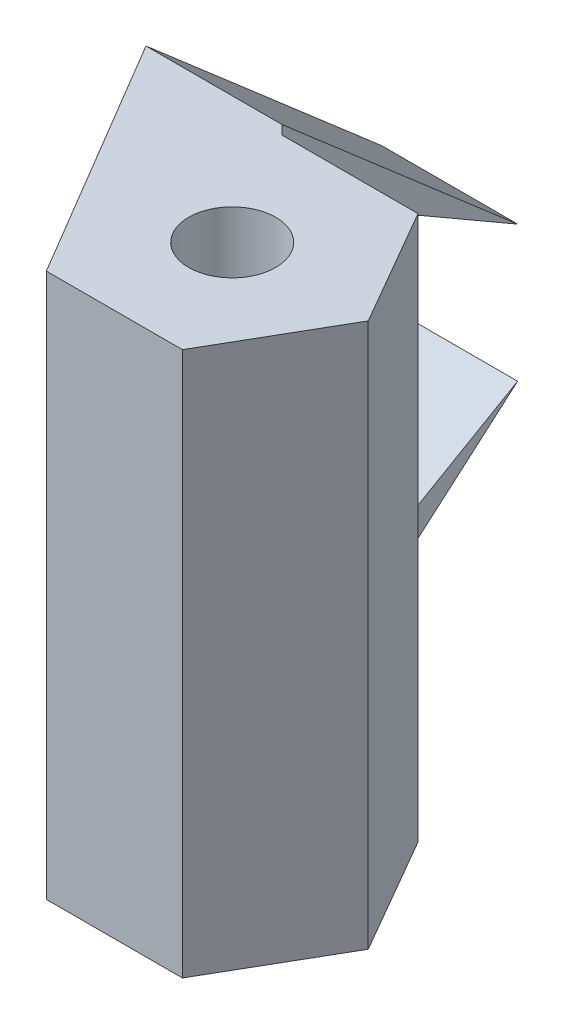
ISO-10303-21;
HEADER;
FILE_DESCRIPTION(('STEP AP214'),'2;1');
FILE_NAME('part.step','',(''),(''),'','','');
FILE_SCHEMA(('AUTOMOTIVE_DESIGN { 1 0 10303 214 1 1 1 1 }'));
ENDSEC;
DATA;
#1=APPLICATION_CONTEXT('core data for automotive mechanical design processes');
#2=APPLICATION_PROTOCOL_DEFINITION('international standard','automotive_design',2000,#1);
#3=PRODUCT_CONTEXT('',#1,'mechanical');
#4=PRODUCT('Part','Part','',(#3));
#5=PRODUCT_RELATED_PRODUCT_CATEGORY('part','',(#4));
#6=PRODUCT_DEFINITION_FORMATION('','',#4);
#7=PRODUCT_DEFINITION_CONTEXT('part definition',#1,'design');
#8=PRODUCT_DEFINITION('design','',#6,#7);
#9=PRODUCT_DEFINITION_SHAPE('','',#8);
#10=(LENGTH_UNIT() NAMED_UNIT(*) SI_UNIT(.MILLI.,.METRE.));
#11=(NAMED_UNIT(*) PLANE_ANGLE_UNIT() SI_UNIT($,.RADIAN.));
#12=(NAMED_UNIT(*) SI_UNIT($,.STERADIAN.) SOLID_ANGLE_UNIT());
#13=UNCERTAINTY_MEASURE_WITH_UNIT(LENGTH_MEASURE(1.E-05),#10,'distance_accuracy_value','');
#14=(GEOMETRIC_REPRESENTATION_CONTEXT(3) GLOBAL_UNCERTAINTY_ASSIGNED_CONTEXT((#13)) GLOBAL_UNIT_ASSIGNED_CONTEXT((#10,
#11,#12)) REPRESENTATION_CONTEXT('',''));
#15=CARTESIAN_POINT('',(0.,0.,0.));
#16=DIRECTION('',(0.,0.,1.));
#17=DIRECTION('',(1.,0.,0.));
#18=AXIS2_PLACEMENT_3D('',#15,#16,#17);
#19=CARTESIAN_POINT('',(-9.9503693429844,0.,-5.92463065701559));
#20=DIRECTION('',(0.,0.,-1.));
#21=DIRECTION('',(-1.,0.,0.));
#22=AXIS2_PLACEMENT_3D('',#19,#20,#21);
#23=PLANE('',#22);
#24=DIRECTION('',(-1.,0.,0.));
#25=VECTOR('',#24,1.);
#26=CARTESIAN_POINT('',(-3.60036934298441,15.875,-5.92463065701559));
#27=LINE('',#26,#25);
#28=CARTESIAN_POINT('',(-3.6003693429844,15.875,-5.92463065701559));
#29=VERTEX_POINT('',#28);
#30=CARTESIAN_POINT('',(-9.95036934298441,15.875,-5.92463065701559));
#31=VERTEX_POINT('',#30);
#32=EDGE_CURVE('E61',#29,#31,#27,.T.);
#33=ORIENTED_EDGE('',*,*,#32,.F.);
#34=DIRECTION('',(0.,1.,0.));
#35=VECTOR('',#34,1.);
#36=CARTESIAN_POINT('',(-3.6003693429844,0.,-5.92463065701559));
#37=LINE('',#36,#35);
#38=CARTESIAN_POINT('',(-3.60036934298441,9.525,-5.92463065701559));
#39=VERTEX_POINT('',#38);
#40=EDGE_CURVE('E207',#39,#29,#37,.T.);
#41=ORIENTED_EDGE('',*,*,#40,.F.);
#42=DIRECTION('',(-1.,0.,0.));
#43=VECTOR('',#42,1.);
#44=CARTESIAN_POINT('',(-3.60036934298441,9.525,-5.92463065701559));
#45=LINE('',#44,#43);
#46=CARTESIAN_POINT('',(-9.9503693429844,9.525,-5.92463065701559));
#47=VERTEX_POINT('',#46);
#48=EDGE_CURVE('E186',#39,#47,#45,.T.);
#49=ORIENTED_EDGE('',*,*,#48,.T.);
#50=DIRECTION('',(0.,1.,0.));
#51=VECTOR('',#50,1.);
#52=CARTESIAN_POINT('',(-9.9503693429844,0.,-5.92463065701559));
#53=LINE('',#52,#51);
#54=EDGE_CURVE('E216',#47,#31,#53,.T.);
#55=ORIENTED_EDGE('',*,*,#54,.T.);
#56=EDGE_LOOP('',(#33,#41,#49,#55));
#57=FACE_BOUND('',#56,.T.);
#58=ADVANCED_FACE('F41',(#57),#23,.T.);
#59=CARTESIAN_POINT('',(6.35,25.4,0.));
#60=DIRECTION('',(-0.866025403784439,0.,0.5));
#61=DIRECTION('',(0.5,0.,0.866025403784439));
#62=AXIS2_PLACEMENT_3D('',#59,#60,#61);
#63=PLANE('',#62);
#64=DIRECTION('',(-0.5,0.,-0.866025403784439));
#65=VECTOR('',#64,1.);
#66=CARTESIAN_POINT('',(6.35,0.,0.));
#67=LINE('',#66,#65);
#68=CARTESIAN_POINT('',(6.35,0.,0.));
#69=VERTEX_POINT('',#68);
#70=CARTESIAN_POINT('',(3.175,0.,-5.49926131403118));
#71=VERTEX_POINT('',#70);
#72=EDGE_CURVE('E224',#69,#71,#67,.T.);
#73=ORIENTED_EDGE('',*,*,#72,.T.);
#74=DIRECTION('',(0.,-1.,0.));
#75=VECTOR('',#74,1.);
#76=CARTESIAN_POINT('',(3.175,25.4,-5.49926131403118));
#77=LINE('',#76,#75);
#78=CARTESIAN_POINT('',(3.175,25.4,-5.49926131403118));
#79=VERTEX_POINT('',#78);
#80=EDGE_CURVE('E11',#79,#71,#77,.T.);
#81=ORIENTED_EDGE('',*,*,#80,.F.);
#82=DIRECTION('',(-0.5,0.,-0.866025403784439));
#83=VECTOR('',#82,1.);
#84=CARTESIAN_POINT('',(6.35,25.4,0.));
#85=LINE('',#84,#83);
#86=CARTESIAN_POINT('',(6.35,25.4,0.));
#87=VERTEX_POINT('',#86);
#88=EDGE_CURVE('E227',#87,#79,#85,.T.);
#89=ORIENTED_EDGE('',*,*,#88,.F.);
#90=DIRECTION('',(0.,-1.,0.));
#91=VECTOR('',#90,1.);
#92=CARTESIAN_POINT('',(6.35,25.4,0.));
#93=LINE('',#92,#91);
#94=EDGE_CURVE('E240',#87,#69,#93,.T.);
#95=ORIENTED_EDGE('',*,*,#94,.T.);
#96=EDGE_LOOP('',(#73,#81,#89,#95));
#97=FACE_BOUND('',#96,.T.);
#98=ADVANCED_FACE('F43',(#97),#63,.F.);
#99=CARTESIAN_POINT('',(3.175,25.4,-5.49926131403118));
#100=DIRECTION('',(0.,0.,1.));
#101=DIRECTION('',(1.,0.,0.));
#102=AXIS2_PLACEMENT_3D('',#99,#100,#101);
#103=PLANE('',#102);
#104=DIRECTION('',(-1.,0.,0.));
#105=VECTOR('',#104,1.);
#106=CARTESIAN_POINT('',(3.175,0.,-5.49926131403118));
#107=LINE('',#106,#105);
#108=CARTESIAN_POINT('',(-3.175,0.,-5.49926131403118));
#109=VERTEX_POINT('',#108);
#110=EDGE_CURVE('E238',#71,#109,#107,.T.);
#111=ORIENTED_EDGE('',*,*,#110,.T.);
#112=DIRECTION('',(0.,-1.,0.));
#113=VECTOR('',#112,1.);
#114=CARTESIAN_POINT('',(-3.175,25.4,-5.49926131403118));
#115=LINE('',#114,#113);
#116=CARTESIAN_POINT('',(-3.175,25.4,-5.49926131403118));
#117=VERTEX_POINT('',#116);
#118=EDGE_CURVE('E47',#117,#109,#115,.T.);
#119=ORIENTED_EDGE('',*,*,#118,.F.);
#120=DIRECTION('',(-1.,0.,0.));
#121=VECTOR('',#120,1.);
#122=CARTESIAN_POINT('',(3.175,25.4,-5.49926131403118));
#123=LINE('',#122,#121);
#124=EDGE_CURVE('E226',#79,#117,#123,.T.);
#125=ORIENTED_EDGE('',*,*,#124,.F.);
#126=ORIENTED_EDGE('',*,*,#80,.T.);
#127=EDGE_LOOP('',(#111,#119,#125,#126));
#128=FACE_BOUND('',#127,.T.);
#129=ADVANCED_FACE('F263',(#128),#103,.F.);
#130=CARTESIAN_POINT('',(-3.175,25.4,5.49926131403119));
#131=DIRECTION('',(0.,0.,-1.));
#132=DIRECTION('',(-1.,0.,0.));
#133=AXIS2_PLACEMENT_3D('',#130,#131,#132);
#134=PLANE('',#133);
#135=DIRECTION('',(1.,0.,0.));
#136=VECTOR('',#135,1.);
#137=CARTESIAN_POINT('',(-3.175,0.,5.49926131403119));
#138=LINE('',#137,#136);
#139=CARTESIAN_POINT('',(-3.175,0.,5.49926131403119));
#140=VERTEX_POINT('',#139);
#141=CARTESIAN_POINT('',(3.175,0.,5.49926131403119));
#142=VERTEX_POINT('',#141);
#143=EDGE_CURVE('E245',#140,#142,#138,.T.);
#144=ORIENTED_EDGE('',*,*,#143,.T.);
#145=DIRECTION('',(0.,-1.,0.));
#146=VECTOR('',#145,1.);
#147=CARTESIAN_POINT('',(3.175,25.4,5.49926131403119));
#148=LINE('',#147,#146);
#149=CARTESIAN_POINT('',(3.175,25.4,5.49926131403119));
#150=VERTEX_POINT('',#149);
#151=EDGE_CURVE('E248',#150,#142,#148,.T.);
#152=ORIENTED_EDGE('',*,*,#151,.F.);
#153=DIRECTION('',(1.,0.,0.));
#154=VECTOR('',#153,1.);
#155=CARTESIAN_POINT('',(-3.175,25.4,5.49926131403119));
#156=LINE('',#155,#154);
#157=CARTESIAN_POINT('',(-3.175,25.4,5.49926131403119));
#158=VERTEX_POINT('',#157);
#159=EDGE_CURVE('E233',#158,#150,#156,.T.);
#160=ORIENTED_EDGE('',*,*,#159,.F.);
#161=DIRECTION('',(0.,-1.,0.));
#162=VECTOR('',#161,1.);
#163=CARTESIAN_POINT('',(-3.175,25.4,5.49926131403119));
#164=LINE('',#163,#162);
#165=EDGE_CURVE('E253',#158,#140,#164,.T.);
#166=ORIENTED_EDGE('',*,*,#165,.T.);
#167=EDGE_LOOP('',(#144,#152,#160,#166));
#168=FACE_BOUND('',#167,.T.);
#169=ADVANCED_FACE('F277',(#168),#134,.F.);
#170=CARTESIAN_POINT('',(3.175,25.4,5.49926131403119));
#171=DIRECTION('',(-0.866025403784439,0.,-0.5));
#172=DIRECTION('',(-0.5,0.,0.866025403784439));
#173=AXIS2_PLACEMENT_3D('',#170,#171,#172);
#174=PLANE('',#173);
#175=DIRECTION('',(0.5,0.,-0.866025403784439));
#176=VECTOR('',#175,1.);
#177=CARTESIAN_POINT('',(3.175,0.,5.49926131403119));
#178=LINE('',#177,#176);
#179=EDGE_CURVE('E228',#142,#69,#178,.T.);
#180=ORIENTED_EDGE('',*,*,#179,.T.);
#181=ORIENTED_EDGE('',*,*,#94,.F.);
#182=DIRECTION('',(0.5,0.,-0.866025403784439));
#183=VECTOR('',#182,1.);
#184=CARTESIAN_POINT('',(3.175,25.4,5.49926131403119));
#185=LINE('',#184,#183);
#186=EDGE_CURVE('E231',#150,#87,#185,.T.);
#187=ORIENTED_EDGE('',*,*,#186,.F.);
#188=ORIENTED_EDGE('',*,*,#151,.T.);
#189=EDGE_LOOP('',(#180,#181,#187,#188));
#190=FACE_BOUND('',#189,.T.);
#191=ADVANCED_FACE('F271',(#190),#174,.F.);
#192=CARTESIAN_POINT('',(0.,25.4,0.));
#193=DIRECTION('',(0.,1.,0.));
#194=DIRECTION('',(0.,0.,1.));
#195=AXIS2_PLACEMENT_3D('',#192,#193,#194);
#196=PLANE('',#195);
#197=CARTESIAN_POINT('',(0.,25.4,0.));
#198=DIRECTION('',(0.,1.,0.));
#199=DIRECTION('',(0.,0.,1.));
#200=AXIS2_PLACEMENT_3D('',#197,#198,#199);
#201=CIRCLE('',#200,2.032);
#202=CARTESIAN_POINT('',(0.,25.4,2.032));
#203=VERTEX_POINT('',#202);
#204=EDGE_CURVE('E214',#203,#203,#201,.T.);
#205=ORIENTED_EDGE('',*,*,#204,.F.);
#206=EDGE_LOOP('',(#205));
#207=FACE_BOUND('',#206,.T.);
#208=ORIENTED_EDGE('',*,*,#88,.T.);
#209=ORIENTED_EDGE('',*,*,#124,.T.);
#210=DIRECTION('',(-0.707106781186546,0.,-0.707106781186549));
#211=VECTOR('',#210,1.);
#212=CARTESIAN_POINT('',(-3.175,25.4,-5.49926131403118));
#213=LINE('',#212,#211);
#214=CARTESIAN_POINT('',(-3.6003693429844,25.4,-5.92463065701559));
#215=VERTEX_POINT('',#214);
#216=EDGE_CURVE('E178',#117,#215,#213,.T.);
#217=ORIENTED_EDGE('',*,*,#216,.T.);
#218=DIRECTION('',(-1.,0.,0.));
#219=VECTOR('',#218,1.);
#220=CARTESIAN_POINT('',(-9.9503693429844,25.4,-5.92463065701559));
#221=LINE('',#220,#219);
#222=CARTESIAN_POINT('',(-9.9503693429844,25.4,-5.92463065701559));
#223=VERTEX_POINT('',#222);
#224=EDGE_CURVE('E165',#215,#223,#221,.T.);
#225=ORIENTED_EDGE('',*,*,#224,.T.);
#226=DIRECTION('',(0.51011749779793,0.,0.860104725274997));
#227=VECTOR('',#226,1.);
#228=CARTESIAN_POINT('',(-3.175,25.4,5.49926131403119));
#229=LINE('',#228,#227);
#230=EDGE_CURVE('E202',#223,#158,#229,.T.);
#231=ORIENTED_EDGE('',*,*,#230,.T.);
#232=ORIENTED_EDGE('',*,*,#159,.T.);
#233=ORIENTED_EDGE('',*,*,#186,.T.);
#234=EDGE_LOOP('',(#208,#209,#217,#225,#231,#232,#233));
#235=FACE_BOUND('',#234,.T.);
#236=ADVANCED_FACE('F326',(#207,#235),#196,.T.);
#237=CARTESIAN_POINT('',(0.,0.,0.));
#238=DIRECTION('',(0.,1.,0.));
#239=DIRECTION('',(0.,0.,1.));
#240=AXIS2_PLACEMENT_3D('',#237,#238,#239);
#241=PLANE('',#240);
#242=CARTESIAN_POINT('',(0.,0.,0.));
#243=DIRECTION('',(0.,1.,0.));
#244=DIRECTION('',(0.,0.,1.));
#245=AXIS2_PLACEMENT_3D('',#242,#243,#244);
#246=CIRCLE('',#245,2.032);
#247=CARTESIAN_POINT('',(0.,0.,2.032));
#248=VERTEX_POINT('',#247);
#249=EDGE_CURVE('E219',#248,#248,#246,.T.);
#250=ORIENTED_EDGE('',*,*,#249,.T.);
#251=EDGE_LOOP('',(#250));
#252=FACE_BOUND('',#251,.T.);
#253=ORIENTED_EDGE('',*,*,#72,.F.);
#254=ORIENTED_EDGE('',*,*,#179,.F.);
#255=ORIENTED_EDGE('',*,*,#143,.F.);
#256=DIRECTION('',(0.51011749779793,0.,0.860104725274997));
#257=VECTOR('',#256,1.);
#258=CARTESIAN_POINT('',(-3.175,0.,5.49926131403119));
#259=LINE('',#258,#257);
#260=CARTESIAN_POINT('',(-9.9503693429844,0.,-5.92463065701559));
#261=VERTEX_POINT('',#260);
#262=EDGE_CURVE('E210',#261,#140,#259,.T.);
#263=ORIENTED_EDGE('',*,*,#262,.F.);
#264=DIRECTION('',(-1.,0.,0.));
#265=VECTOR('',#264,1.);
#266=CARTESIAN_POINT('',(-9.9503693429844,0.,-5.92463065701559));
#267=LINE('',#266,#265);
#268=CARTESIAN_POINT('',(-3.6003693429844,0.,-5.92463065701559));
#269=VERTEX_POINT('',#268);
#270=EDGE_CURVE('E204',#269,#261,#267,.T.);
#271=ORIENTED_EDGE('',*,*,#270,.F.);
#272=DIRECTION('',(-0.707106781186546,0.,-0.707106781186549));
#273=VECTOR('',#272,1.);
#274=CARTESIAN_POINT('',(-3.175,0.,-5.49926131403118));
#275=LINE('',#274,#273);
#276=EDGE_CURVE('E203',#109,#269,#275,.T.);
#277=ORIENTED_EDGE('',*,*,#276,.F.);
#278=ORIENTED_EDGE('',*,*,#110,.F.);
#279=EDGE_LOOP('',(#253,#254,#255,#263,#271,#277,#278));
#280=FACE_BOUND('',#279,.T.);
#281=ADVANCED_FACE('F261',(#252,#280),#241,.F.);
#282=CARTESIAN_POINT('',(0.,0.,0.));
#283=DIRECTION('',(0.,1.,0.));
#284=DIRECTION('',(0.,0.,1.));
#285=AXIS2_PLACEMENT_3D('',#282,#283,#284);
#286=CYLINDRICAL_SURFACE('',#285,2.032);
#287=ORIENTED_EDGE('',*,*,#249,.F.);
#288=EDGE_LOOP('',(#287));
#289=FACE_BOUND('',#288,.T.);
#290=ORIENTED_EDGE('',*,*,#204,.T.);
#291=EDGE_LOOP('',(#290));
#292=FACE_BOUND('',#291,.T.);
#293=ADVANCED_FACE('F325',(#289,#292),#286,.F.);
#294=CARTESIAN_POINT('',(-3.175,0.,5.49926131403119));
#295=DIRECTION('',(-0.860104725274997,0.,0.51011749779793));
#296=DIRECTION('',(0.51011749779793,0.,0.860104725274997));
#297=AXIS2_PLACEMENT_3D('',#294,#295,#296);
#298=PLANE('',#297);
#299=ORIENTED_EDGE('',*,*,#230,.F.);
#300=DIRECTION('',(0.,1.,0.));
#301=VECTOR('',#300,1.);
#302=CARTESIAN_POINT('',(-9.95036934298441,0.,-5.92463065701559));
#303=LINE('',#302,#301);
#304=EDGE_CURVE('E172',#31,#223,#303,.T.);
#305=ORIENTED_EDGE('',*,*,#304,.F.);
#306=ORIENTED_EDGE('',*,*,#54,.F.);
#307=EDGE_CURVE('E57',#261,#47,#53,.T.);
#308=ORIENTED_EDGE('',*,*,#307,.F.);
#309=ORIENTED_EDGE('',*,*,#262,.T.);
#310=ORIENTED_EDGE('',*,*,#165,.F.);
#311=EDGE_LOOP('',(#299,#305,#306,#308,#309,#310));
#312=FACE_BOUND('',#311,.T.);
#313=ADVANCED_FACE('F278',(#312),#298,.T.);
#314=CARTESIAN_POINT('',(-3.175,0.,-5.49926131403118));
#315=DIRECTION('',(0.707106781186549,0.,-0.707106781186546));
#316=DIRECTION('',(-0.707106781186546,0.,-0.707106781186549));
#317=AXIS2_PLACEMENT_3D('',#314,#315,#316);
#318=PLANE('',#317);
#319=ORIENTED_EDGE('',*,*,#216,.F.);
#320=ORIENTED_EDGE('',*,*,#118,.T.);
#321=ORIENTED_EDGE('',*,*,#276,.T.);
#322=EDGE_CURVE('E220',#269,#39,#37,.T.);
#323=ORIENTED_EDGE('',*,*,#322,.T.);
#324=ORIENTED_EDGE('',*,*,#40,.T.);
#325=DIRECTION('',(0.,1.,0.));
#326=VECTOR('',#325,1.);
#327=CARTESIAN_POINT('',(-3.60036934298441,0.,-5.9246306570156));
#328=LINE('',#327,#326);
#329=EDGE_CURVE('E162',#29,#215,#328,.T.);
#330=ORIENTED_EDGE('',*,*,#329,.T.);
#331=EDGE_LOOP('',(#319,#320,#321,#323,#324,#330));
#332=FACE_BOUND('',#331,.T.);
#333=ADVANCED_FACE('F258',(#332),#318,.T.);
#334=CARTESIAN_POINT('',(-3.6003693429844,-2.93193180400891,-2.53912742443526));
#335=DIRECTION('',(0.,-0.755928946018454,-0.654653670707977));
#336=DIRECTION('',(0.,0.654653670707977,-0.755928946018455));
#337=AXIS2_PLACEMENT_3D('',#334,#335,#336);
#338=PLANE('',#337);
#339=DIRECTION('',(0.,-0.654653670707977,0.755928946018454));
#340=VECTOR('',#339,1.);
#341=CARTESIAN_POINT('',(-9.9503693429844,-2.93193180400891,-2.53912742443525));
#342=LINE('',#341,#340);
#343=CARTESIAN_POINT('',(-9.95036934298441,9.525,-16.923153285078));
#344=VERTEX_POINT('',#343);
#345=EDGE_CURVE('E188',#344,#261,#342,.T.);
#346=ORIENTED_EDGE('',*,*,#345,.F.);
#347=DIRECTION('',(-1.,0.,0.));
#348=VECTOR('',#347,1.);
#349=CARTESIAN_POINT('',(-3.60036934298441,9.525,-16.923153285078));
#350=LINE('',#349,#348);
#351=CARTESIAN_POINT('',(-3.60036934298441,9.525,-16.923153285078));
#352=VERTEX_POINT('',#351);
#353=EDGE_CURVE('E174',#352,#344,#350,.T.);
#354=ORIENTED_EDGE('',*,*,#353,.F.);
#355=DIRECTION('',(0.,-0.654653670707977,0.755928946018454));
#356=VECTOR('',#355,1.);
#357=CARTESIAN_POINT('',(-3.6003693429844,-2.93193180400891,-2.53912742443526));
#358=LINE('',#357,#356);
#359=EDGE_CURVE('E182',#352,#269,#358,.T.);
#360=ORIENTED_EDGE('',*,*,#359,.T.);
#361=ORIENTED_EDGE('',*,*,#270,.T.);
#362=EDGE_LOOP('',(#346,#354,#360,#361));
#363=FACE_BOUND('',#362,.T.);
#364=ADVANCED_FACE('F291',(#363),#338,.T.);
#365=CARTESIAN_POINT('',(-3.6003693429844,-0.184190328507801,-0.106342335746104));
#366=DIRECTION('',(0.,-0.866025403784439,-0.5));
#367=DIRECTION('',(0.,0.5,-0.866025403784439));
#368=AXIS2_PLACEMENT_3D('',#365,#366,#367);
#369=PLANE('',#368);
#370=DIRECTION('',(0.,-0.5,0.866025403784439));
#371=VECTOR('',#370,1.);
#372=CARTESIAN_POINT('',(-9.9503693429844,-0.184190328507801,-0.106342335746102));
#373=LINE('',#372,#371);
#374=CARTESIAN_POINT('',(-9.95036934298441,6.35,-11.4238919710468));
#375=VERTEX_POINT('',#374);
#376=EDGE_CURVE('E183',#344,#375,#373,.T.);
#377=ORIENTED_EDGE('',*,*,#376,.T.);
#378=DIRECTION('',(-1.,0.,0.));
#379=VECTOR('',#378,1.);
#380=CARTESIAN_POINT('',(-3.60036934298441,6.35,-11.4238919710468));
#381=LINE('',#380,#379);
#382=CARTESIAN_POINT('',(-3.60036934298441,6.35,-11.4238919710468));
#383=VERTEX_POINT('',#382);
#384=EDGE_CURVE('E198',#383,#375,#381,.T.);
#385=ORIENTED_EDGE('',*,*,#384,.F.);
#386=DIRECTION('',(0.,-0.5,0.866025403784439));
#387=VECTOR('',#386,1.);
#388=CARTESIAN_POINT('',(-3.6003693429844,-0.184190328507801,-0.106342335746104));
#389=LINE('',#388,#387);
#390=EDGE_CURVE('E189',#352,#383,#389,.T.);
#391=ORIENTED_EDGE('',*,*,#390,.F.);
#392=ORIENTED_EDGE('',*,*,#353,.T.);
#393=EDGE_LOOP('',(#377,#385,#391,#392));
#394=FACE_BOUND('',#393,.T.);
#395=ADVANCED_FACE('F393',(#394),#369,.F.);
#396=CARTESIAN_POINT('',(-3.60036934298441,9.70919032850779,-5.60560364977729));
#397=DIRECTION('',(0.,-0.866025403784438,0.5));
#398=DIRECTION('',(0.,-0.500000000000001,-0.866025403784438));
#399=AXIS2_PLACEMENT_3D('',#396,#397,#398);
#400=PLANE('',#399);
#401=DIRECTION('',(0.,0.500000000000001,0.866025403784438));
#402=VECTOR('',#401,1.);
#403=CARTESIAN_POINT('',(-9.95036934298441,9.70919032850779,-5.60560364977729));
#404=LINE('',#403,#402);
#405=EDGE_CURVE('E195',#375,#47,#404,.T.);
#406=ORIENTED_EDGE('',*,*,#405,.T.);
#407=ORIENTED_EDGE('',*,*,#48,.F.);
#408=DIRECTION('',(0.,0.500000000000001,0.866025403784438));
#409=VECTOR('',#408,1.);
#410=CARTESIAN_POINT('',(-3.60036934298441,9.70919032850779,-5.60560364977729));
#411=LINE('',#410,#409);
#412=EDGE_CURVE('E184',#383,#39,#411,.T.);
#413=ORIENTED_EDGE('',*,*,#412,.F.);
#414=ORIENTED_EDGE('',*,*,#384,.T.);
#415=EDGE_LOOP('',(#406,#407,#413,#414));
#416=FACE_BOUND('',#415,.T.);
#417=ADVANCED_FACE('F287',(#416),#400,.F.);
#418=CARTESIAN_POINT('',(-3.6003693429844,0.,0.));
#419=DIRECTION('',(-1.,0.,0.));
#420=DIRECTION('',(0.,0.,1.));
#421=AXIS2_PLACEMENT_3D('',#418,#419,#420);
#422=PLANE('',#421);
#423=ORIENTED_EDGE('',*,*,#359,.F.);
#424=ORIENTED_EDGE('',*,*,#390,.T.);
#425=ORIENTED_EDGE('',*,*,#412,.T.);
#426=ORIENTED_EDGE('',*,*,#322,.F.);
#427=EDGE_LOOP('',(#423,#424,#425,#426));
#428=FACE_BOUND('',#427,.T.);
#429=ADVANCED_FACE('F299',(#428),#422,.F.);
#430=CARTESIAN_POINT('',(-9.9503693429844,0.,0.));
#431=DIRECTION('',(-1.,0.,0.));
#432=DIRECTION('',(0.,0.,1.));
#433=AXIS2_PLACEMENT_3D('',#430,#431,#432);
#434=PLANE('',#433);
#435=ORIENTED_EDGE('',*,*,#345,.T.);
#436=ORIENTED_EDGE('',*,*,#307,.T.);
#437=ORIENTED_EDGE('',*,*,#405,.F.);
#438=ORIENTED_EDGE('',*,*,#376,.F.);
#439=EDGE_LOOP('',(#435,#436,#437,#438));
#440=FACE_BOUND('',#439,.T.);
#441=ADVANCED_FACE('F289',(#440),#434,.T.);
#442=CARTESIAN_POINT('',(-3.6003693429844,9.3408096714922,5.39291897828508));
#443=DIRECTION('',(0.,0.866025403784439,0.5));
#444=DIRECTION('',(0.,-0.5,0.866025403784439));
#445=AXIS2_PLACEMENT_3D('',#442,#443,#444);
#446=PLANE('',#445);
#447=DIRECTION('',(0.,0.5,-0.866025403784439));
#448=VECTOR('',#447,1.);
#449=CARTESIAN_POINT('',(-9.9503693429844,9.3408096714922,5.39291897828508));
#450=LINE('',#449,#448);
#451=CARTESIAN_POINT('',(-9.95036934298441,19.05,-11.4238919710468));
#452=VERTEX_POINT('',#451);
#453=EDGE_CURVE('E169',#31,#452,#450,.T.);
#454=ORIENTED_EDGE('',*,*,#453,.T.);
#455=DIRECTION('',(-1.,0.,0.));
#456=VECTOR('',#455,1.);
#457=CARTESIAN_POINT('',(-3.60036934298441,19.05,-11.4238919710468));
#458=LINE('',#457,#456);
#459=CARTESIAN_POINT('',(-3.60036934298441,19.05,-11.4238919710468));
#460=VERTEX_POINT('',#459);
#461=EDGE_CURVE('E157',#460,#452,#458,.T.);
#462=ORIENTED_EDGE('',*,*,#461,.F.);
#463=DIRECTION('',(0.,0.5,-0.866025403784439));
#464=VECTOR('',#463,1.);
#465=CARTESIAN_POINT('',(-3.6003693429844,9.3408096714922,5.39291897828508));
#466=LINE('',#465,#464);
#467=EDGE_CURVE('E150',#29,#460,#466,.T.);
#468=ORIENTED_EDGE('',*,*,#467,.F.);
#469=ORIENTED_EDGE('',*,*,#32,.T.);
#470=EDGE_LOOP('',(#454,#462,#468,#469));
#471=FACE_BOUND('',#470,.T.);
#472=ADVANCED_FACE('F296',(#471),#446,.F.);
#473=CARTESIAN_POINT('',(-3.60036934298441,19.2341903285078,-11.1048649638085));
#474=DIRECTION('',(0.,0.866025403784438,-0.5));
#475=DIRECTION('',(0.,0.500000000000001,0.866025403784438));
#476=AXIS2_PLACEMENT_3D('',#473,#474,#475);
#477=PLANE('',#476);
#478=DIRECTION('',(0.,-0.500000000000001,-0.866025403784438));
#479=VECTOR('',#478,1.);
#480=CARTESIAN_POINT('',(-9.95036934298441,19.2341903285078,-11.1048649638085));
#481=LINE('',#480,#479);
#482=CARTESIAN_POINT('',(-9.95036934298441,15.875,-16.923153285078));
#483=VERTEX_POINT('',#482);
#484=EDGE_CURVE('E154',#452,#483,#481,.T.);
#485=ORIENTED_EDGE('',*,*,#484,.T.);
#486=DIRECTION('',(-1.,0.,0.));
#487=VECTOR('',#486,1.);
#488=CARTESIAN_POINT('',(-3.60036934298441,15.875,-16.923153285078));
#489=LINE('',#488,#487);
#490=CARTESIAN_POINT('',(-3.60036934298441,15.875,-16.923153285078));
#491=VERTEX_POINT('',#490);
#492=EDGE_CURVE('E153',#491,#483,#489,.T.);
#493=ORIENTED_EDGE('',*,*,#492,.F.);
#494=DIRECTION('',(0.,-0.500000000000001,-0.866025403784438));
#495=VECTOR('',#494,1.);
#496=CARTESIAN_POINT('',(-3.60036934298441,19.2341903285078,-11.1048649638085));
#497=LINE('',#496,#495);
#498=EDGE_CURVE('E139',#460,#491,#497,.T.);
#499=ORIENTED_EDGE('',*,*,#498,.F.);
#500=ORIENTED_EDGE('',*,*,#461,.T.);
#501=EDGE_LOOP('',(#485,#493,#499,#500));
#502=FACE_BOUND('',#501,.T.);
#503=ADVANCED_FACE('F152',(#502),#477,.F.);
#504=CARTESIAN_POINT('',(-3.60036934298441,17.4462175182946,-15.1088675707923));
#505=DIRECTION('',(0.,-0.755928946018454,0.654653670707978));
#506=DIRECTION('',(0.,-0.654653670707978,-0.755928946018454));
#507=AXIS2_PLACEMENT_3D('',#504,#505,#506);
#508=PLANE('',#507);
#509=DIRECTION('',(0.,0.654653670707978,0.755928946018454));
#510=VECTOR('',#509,1.);
#511=CARTESIAN_POINT('',(-9.95036934298441,17.4462175182946,-15.1088675707923));
#512=LINE('',#511,#510);
#513=EDGE_CURVE('E173',#483,#223,#512,.T.);
#514=ORIENTED_EDGE('',*,*,#513,.T.);
#515=ORIENTED_EDGE('',*,*,#224,.F.);
#516=DIRECTION('',(0.,0.654653670707978,0.755928946018454));
#517=VECTOR('',#516,1.);
#518=CARTESIAN_POINT('',(-3.60036934298441,17.4462175182946,-15.1088675707923));
#519=LINE('',#518,#517);
#520=EDGE_CURVE('E145',#491,#215,#519,.T.);
#521=ORIENTED_EDGE('',*,*,#520,.F.);
#522=ORIENTED_EDGE('',*,*,#492,.T.);
#523=EDGE_LOOP('',(#514,#515,#521,#522));
#524=FACE_BOUND('',#523,.T.);
#525=ADVANCED_FACE('F161',(#524),#508,.F.);
#526=CARTESIAN_POINT('',(-3.6003693429844,0.,0.));
#527=DIRECTION('',(-1.,0.,0.));
#528=DIRECTION('',(0.,0.,1.));
#529=AXIS2_PLACEMENT_3D('',#526,#527,#528);
#530=PLANE('',#529);
#531=ORIENTED_EDGE('',*,*,#467,.T.);
#532=ORIENTED_EDGE('',*,*,#498,.T.);
#533=ORIENTED_EDGE('',*,*,#520,.T.);
#534=ORIENTED_EDGE('',*,*,#329,.F.);
#535=EDGE_LOOP('',(#531,#532,#533,#534));
#536=FACE_BOUND('',#535,.T.);
#537=ADVANCED_FACE('F143',(#536),#530,.F.);
#538=CARTESIAN_POINT('',(-9.9503693429844,0.,0.));
#539=DIRECTION('',(-1.,0.,0.));
#540=DIRECTION('',(0.,0.,1.));
#541=AXIS2_PLACEMENT_3D('',#538,#539,#540);
#542=PLANE('',#541);
#543=ORIENTED_EDGE('',*,*,#453,.F.);
#544=ORIENTED_EDGE('',*,*,#304,.T.);
#545=ORIENTED_EDGE('',*,*,#513,.F.);
#546=ORIENTED_EDGE('',*,*,#484,.F.);
#547=EDGE_LOOP('',(#543,#544,#545,#546));
#548=FACE_BOUND('',#547,.T.);
#549=ADVANCED_FACE('F305',(#548),#542,.T.);
#550=CLOSED_SHELL('',(#58,#98,#129,#169,#191,#236,#281,#293,#313,#333,#364,#395,#417,#429,#441,
#472,#503,#525,#537,#549));
#551=MANIFOLD_SOLID_BREP('B2',#550);
#552=ADVANCED_BREP_SHAPE_REPRESENTATION('',(#18,#551),#14);
#553=SHAPE_DEFINITION_REPRESENTATION(#9,#552);
ENDSEC;
END-ISO-10303-21;
